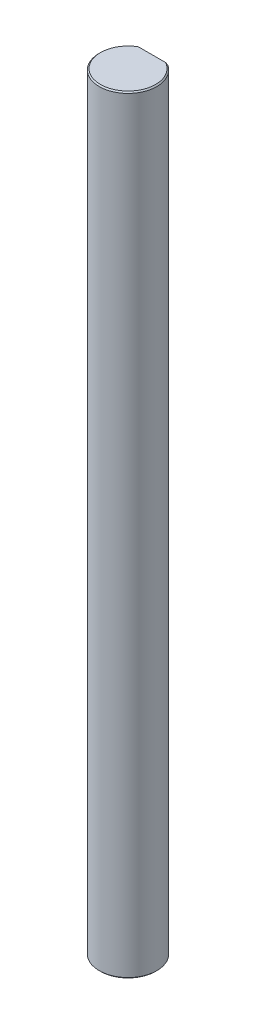
ISO-10303-21;
HEADER;
FILE_DESCRIPTION(('STEP AP214'),'2;1');
FILE_NAME('part.step','',(''),(''),'','','');
FILE_SCHEMA(('AUTOMOTIVE_DESIGN { 1 0 10303 214 1 1 1 1 }'));
ENDSEC;
DATA;
#1=APPLICATION_CONTEXT('core data for automotive mechanical design processes');
#2=APPLICATION_PROTOCOL_DEFINITION('international standard','automotive_design',2000,#1);
#3=PRODUCT_CONTEXT('',#1,'mechanical');
#4=PRODUCT('Part','Part','',(#3));
#5=PRODUCT_RELATED_PRODUCT_CATEGORY('part','',(#4));
#6=PRODUCT_DEFINITION_FORMATION('','',#4);
#7=PRODUCT_DEFINITION_CONTEXT('part definition',#1,'design');
#8=PRODUCT_DEFINITION('design','',#6,#7);
#9=PRODUCT_DEFINITION_SHAPE('','',#8);
#10=(LENGTH_UNIT() NAMED_UNIT(*) SI_UNIT(.MILLI.,.METRE.));
#11=(NAMED_UNIT(*) PLANE_ANGLE_UNIT() SI_UNIT($,.RADIAN.));
#12=(NAMED_UNIT(*) SI_UNIT($,.STERADIAN.) SOLID_ANGLE_UNIT());
#13=UNCERTAINTY_MEASURE_WITH_UNIT(LENGTH_MEASURE(1.E-05),#10,'distance_accuracy_value','');
#14=(GEOMETRIC_REPRESENTATION_CONTEXT(3) GLOBAL_UNCERTAINTY_ASSIGNED_CONTEXT((#13)) GLOBAL_UNIT_ASSIGNED_CONTEXT((#10,
#11,#12)) REPRESENTATION_CONTEXT('',''));
#15=CARTESIAN_POINT('',(0.,0.,0.));
#16=DIRECTION('',(0.,0.,1.));
#17=DIRECTION('',(1.,0.,0.));
#18=AXIS2_PLACEMENT_3D('',#15,#16,#17);
#19=CARTESIAN_POINT('',(0.,0.,0.));
#20=DIRECTION('',(0.,1.,0.));
#21=DIRECTION('',(0.,0.,1.));
#22=AXIS2_PLACEMENT_3D('',#19,#20,#21);
#23=PLANE('',#22);
#24=CARTESIAN_POINT('',(0.,0.,0.));
#25=DIRECTION('',(0.,1.,0.));
#26=DIRECTION('',(0.,0.,1.));
#27=AXIS2_PLACEMENT_3D('',#24,#25,#26);
#28=CIRCLE('',#27,2.87500000001728);
#29=CARTESIAN_POINT('',(-1.41972708646755,0.,-2.5));
#30=VERTEX_POINT('',#29);
#31=CARTESIAN_POINT('',(1.41972708646755,0.,-2.5));
#32=VERTEX_POINT('',#31);
#33=EDGE_CURVE('E20',#30,#32,#28,.T.);
#34=ORIENTED_EDGE('',*,*,#33,.F.);
#35=DIRECTION('',(-1.,0.,0.));
#36=VECTOR('',#35,1.);
#37=CARTESIAN_POINT('',(0.,0.,-2.5));
#38=LINE('',#37,#36);
#39=EDGE_CURVE('E59',#32,#30,#38,.T.);
#40=ORIENTED_EDGE('',*,*,#39,.F.);
#41=EDGE_LOOP('',(#34,#40));
#42=FACE_BOUND('',#41,.T.);
#43=ADVANCED_FACE('F17',(#42),#23,.F.);
#44=CARTESIAN_POINT('',(0.,80.,0.));
#45=DIRECTION('',(0.,1.,0.));
#46=DIRECTION('',(0.,0.,1.));
#47=AXIS2_PLACEMENT_3D('',#44,#45,#46);
#48=PLANE('',#47);
#49=DIRECTION('',(-1.,0.,0.));
#50=VECTOR('',#49,1.);
#51=CARTESIAN_POINT('',(0.,80.,-2.5));
#52=LINE('',#51,#50);
#53=CARTESIAN_POINT('',(-1.41972708638413,79.9999999999921,-2.49999999998279));
#54=VERTEX_POINT('',#53);
#55=CARTESIAN_POINT('',(1.41972708638413,79.9999999999921,-2.49999999998279));
#56=VERTEX_POINT('',#55);
#57=EDGE_CURVE('E67',#54,#56,#52,.F.);
#58=ORIENTED_EDGE('',*,*,#57,.F.);
#59=CARTESIAN_POINT('',(0.,79.9999999999841,0.));
#60=DIRECTION('',(0.,-1.,0.));
#61=DIRECTION('',(0.,0.,-1.));
#62=AXIS2_PLACEMENT_3D('',#59,#60,#61);
#63=CIRCLE('',#62,2.87499999996044);
#64=EDGE_CURVE('E81',#56,#54,#63,.T.);
#65=ORIENTED_EDGE('',*,*,#64,.F.);
#66=EDGE_LOOP('',(#58,#65));
#67=FACE_BOUND('',#66,.T.);
#68=ADVANCED_FACE('F117',(#67),#48,.T.);
#69=CARTESIAN_POINT('',(0.,0.125000000082309,0.));
#70=DIRECTION('',(0.,1.,0.));
#71=DIRECTION('',(0.,0.,1.));
#72=AXIS2_PLACEMENT_3D('',#69,#70,#71);
#73=CONICAL_SURFACE('',#72,3.00000000009959,0.785398163397448);
#74=CARTESIAN_POINT('',(1.6583123951777,0.125000000000014,-2.5));
#75=CARTESIAN_POINT('',(1.53648159923091,0.0576554936557033,-2.5));
#76=CARTESIAN_POINT('',(1.41972708645005,0.,-2.5));
#77=B_SPLINE_CURVE_WITH_KNOTS('',2,(#74,#75,#76),.UNSPECIFIED.,.F.,.F.,(3,3),(0.,1.),.UNSPECIFIED.);
#78=CARTESIAN_POINT('',(1.6583123951777,0.125000000000014,-2.5));
#79=VERTEX_POINT('',#78);
#80=EDGE_CURVE('E61',#79,#32,#77,.T.);
#81=ORIENTED_EDGE('',*,*,#80,.F.);
#82=CARTESIAN_POINT('',(0.,0.125000000000014,0.));
#83=DIRECTION('',(0.,-1.,0.));
#84=DIRECTION('',(0.,0.,-1.));
#85=AXIS2_PLACEMENT_3D('',#82,#83,#84);
#86=CIRCLE('',#85,3.);
#87=CARTESIAN_POINT('',(-1.6583123951777,0.125000000000014,-2.5));
#88=VERTEX_POINT('',#87);
#89=EDGE_CURVE('E65',#88,#79,#86,.F.);
#90=ORIENTED_EDGE('',*,*,#89,.F.);
#91=CARTESIAN_POINT('',(-1.41972708645005,0.,-2.5));
#92=CARTESIAN_POINT('',(-1.53648159923208,0.0576554936563278,-2.5));
#93=CARTESIAN_POINT('',(-1.6583123951777,0.125000000000014,-2.5));
#94=B_SPLINE_CURVE_WITH_KNOTS('',2,(#91,#92,#93),.UNSPECIFIED.,.F.,.F.,(3,3),(0.,1.),.UNSPECIFIED.);
#95=EDGE_CURVE('E63',#30,#88,#94,.T.);
#96=ORIENTED_EDGE('',*,*,#95,.F.);
#97=ORIENTED_EDGE('',*,*,#33,.T.);
#98=EDGE_LOOP('',(#81,#90,#96,#97));
#99=FACE_BOUND('',#98,.T.);
#100=ADVANCED_FACE('F64',(#99),#73,.T.);
#101=CARTESIAN_POINT('',(0.,80.,-2.5));
#102=DIRECTION('',(0.,0.,-1.));
#103=DIRECTION('',(-1.,0.,0.));
#104=AXIS2_PLACEMENT_3D('',#101,#102,#103);
#105=PLANE('',#104);
#106=ORIENTED_EDGE('',*,*,#57,.T.);
#107=CARTESIAN_POINT('',(1.65831239516991,79.8749999999586,-2.49999999998825));
#108=CARTESIAN_POINT('',(1.64826838176816,79.880552028468,-2.50000000042737));
#109=CARTESIAN_POINT('',(1.63820953586368,79.8860772436939,-2.50000000120366));
#110=CARTESIAN_POINT('',(1.61812696085928,79.8970368505675,-2.50000000216666));
#111=CARTESIAN_POINT('',(1.60810342628317,79.9024715986867,-2.50000000235714));
#112=CARTESIAN_POINT('',(1.58809068556603,79.9132502791,-2.50000000092737));
#113=CARTESIAN_POINT('',(1.57810167291724,79.9185945705969,-2.49999999931874));
#114=CARTESIAN_POINT('',(1.55815716530707,79.9291923321743,-2.49999999531701));
#115=CARTESIAN_POINT('',(1.54820186260274,79.9344461640393,-2.49999999292898));
#116=CARTESIAN_POINT('',(1.52832394062326,79.9448630048218,-2.49999998891888));
#117=CARTESIAN_POINT('',(1.51840151216379,79.9500263778204,-2.49999998729208));
#118=CARTESIAN_POINT('',(1.49858848120126,79.960262297792,-2.49999998607419));
#119=CARTESIAN_POINT('',(1.48869806785507,79.9653352108683,-2.49999998647043));
#120=CARTESIAN_POINT('',(1.46894818507344,79.9753902116586,-2.49999998957657));
#121=CARTESIAN_POINT('',(1.45908890291825,79.9803726671648,-2.49999999227213));
#122=CARTESIAN_POINT('',(1.43940037977979,79.990246741915,-2.49999999716559));
#123=CARTESIAN_POINT('',(1.42957132395017,79.9951387303737,-2.49999999936643));
#124=CARTESIAN_POINT('',(1.41972708643055,79.9999999999841,-2.49999999996559));
#125=B_SPLINE_CURVE_WITH_KNOTS('',3,(#107,#108,#109,#110,#111,#112,#113,#114,#115,#116,#117,
#118,#119,#120,#121,#122,#123,#124),.UNSPECIFIED.,.F.,.F.,(4,2,2,2,2,2,2,2,4),(0.,
0.0344291035886779,0.0686352129897365,0.102621448717053,0.136391032119179,0.16994728739444,
0.203293643575441,0.23643363647618,0.269370910594879),.UNSPECIFIED.);
#126=CARTESIAN_POINT('',(1.6583123951738,79.8749999999793,-2.49999999999413));
#127=VERTEX_POINT('',#126);
#128=EDGE_CURVE('E35',#127,#56,#125,.T.);
#129=ORIENTED_EDGE('',*,*,#128,.F.);
#130=DIRECTION('',(0.,-1.,0.));
#131=VECTOR('',#130,1.);
#132=CARTESIAN_POINT('',(1.6583123951777,80.,-2.5));
#133=LINE('',#132,#131);
#134=EDGE_CURVE('E26',#79,#127,#133,.F.);
#135=ORIENTED_EDGE('',*,*,#134,.F.);
#136=ORIENTED_EDGE('',*,*,#80,.T.);
#137=ORIENTED_EDGE('',*,*,#39,.T.);
#138=ORIENTED_EDGE('',*,*,#95,.T.);
#139=DIRECTION('',(0.,-1.,0.));
#140=VECTOR('',#139,1.);
#141=CARTESIAN_POINT('',(-1.6583123951777,80.,-2.5));
#142=LINE('',#141,#140);
#143=CARTESIAN_POINT('',(-1.6583123951777,79.8749999999723,-2.5));
#144=VERTEX_POINT('',#143);
#145=EDGE_CURVE('E77',#144,#88,#142,.T.);
#146=ORIENTED_EDGE('',*,*,#145,.F.);
#147=CARTESIAN_POINT('',(-1.41972708643055,79.9999999999841,-2.49999999996559));
#148=CARTESIAN_POINT('',(-1.42957132395015,79.9951387303737,-2.49999999936644));
#149=CARTESIAN_POINT('',(-1.43940037977976,79.990246741915,-2.49999999716561));
#150=CARTESIAN_POINT('',(-1.4590889029182,79.9803726671648,-2.49999999227216));
#151=CARTESIAN_POINT('',(-1.46894818507337,79.9753902116586,-2.49999998957661));
#152=CARTESIAN_POINT('',(-1.48869806785499,79.9653352108683,-2.49999998647048));
#153=CARTESIAN_POINT('',(-1.49858848120117,79.960262297792,-2.49999998607424));
#154=CARTESIAN_POINT('',(-1.5184015121637,79.9500263778204,-2.49999998729214));
#155=CARTESIAN_POINT('',(-1.52832394062317,79.9448630048218,-2.49999998891894));
#156=CARTESIAN_POINT('',(-1.54820186260265,79.9344461640393,-2.49999999292904));
#157=CARTESIAN_POINT('',(-1.55815716530698,79.9291923321743,-2.49999999531707));
#158=CARTESIAN_POINT('',(-1.57810167291716,79.9185945705969,-2.49999999931879));
#159=CARTESIAN_POINT('',(-1.58809068556595,79.9132502791,-2.50000000092742));
#160=CARTESIAN_POINT('',(-1.60810342628311,79.9024715986867,-2.50000000235718));
#161=CARTESIAN_POINT('',(-1.61812696085923,79.8970368505675,-2.50000000216669));
#162=CARTESIAN_POINT('',(-1.63820953586365,79.8860772436939,-2.50000000120368));
#163=CARTESIAN_POINT('',(-1.64826838176814,79.880552028468,-2.50000000042738));
#164=CARTESIAN_POINT('',(-1.65831239516991,79.8749999999586,-2.49999999998825));
#165=B_SPLINE_CURVE_WITH_KNOTS('',3,(#147,#148,#149,#150,#151,#152,#153,#154,#155,#156,#157,
#158,#159,#160,#161,#162,#163,#164),.UNSPECIFIED.,.F.,.F.,(4,2,2,2,2,2,2,2,4),(0.,
0.0329372741186619,0.0660772670193744,0.0994236232003601,0.132979878475617,0.166749461877748,
0.20073569760508,0.234941807006164,0.269370910594879),.UNSPECIFIED.);
#166=EDGE_CURVE('E85',#54,#144,#165,.T.);
#167=ORIENTED_EDGE('',*,*,#166,.F.);
#168=EDGE_LOOP('',(#106,#129,#135,#136,#137,#138,#146,#167));
#169=FACE_BOUND('',#168,.T.);
#170=ADVANCED_FACE('F69',(#169),#105,.T.);
#171=CARTESIAN_POINT('',(0.,79.8750000000723,0.));
#172=DIRECTION('',(0.,-1.,0.));
#173=DIRECTION('',(0.,0.,-1.));
#174=AXIS2_PLACEMENT_3D('',#171,#172,#173);
#175=CONICAL_SURFACE('',#174,2.99999999987222,0.785398163397448);
#176=ORIENTED_EDGE('',*,*,#128,.T.);
#177=ORIENTED_EDGE('',*,*,#64,.T.);
#178=ORIENTED_EDGE('',*,*,#166,.T.);
#179=CARTESIAN_POINT('',(0.,79.875,0.));
#180=DIRECTION('',(0.,-1.,0.));
#181=DIRECTION('',(0.,0.,-1.));
#182=AXIS2_PLACEMENT_3D('',#179,#180,#181);
#183=CIRCLE('',#182,3.);
#184=EDGE_CURVE('E11',#127,#144,#183,.T.);
#185=ORIENTED_EDGE('',*,*,#184,.F.);
#186=EDGE_LOOP('',(#176,#177,#178,#185));
#187=FACE_BOUND('',#186,.T.);
#188=ADVANCED_FACE('F87',(#187),#175,.T.);
#189=CARTESIAN_POINT('',(0.,80.,0.));
#190=DIRECTION('',(0.,-1.,0.));
#191=DIRECTION('',(0.,0.,-1.));
#192=AXIS2_PLACEMENT_3D('',#189,#190,#191);
#193=CYLINDRICAL_SURFACE('',#192,3.);
#194=ORIENTED_EDGE('',*,*,#134,.T.);
#195=ORIENTED_EDGE('',*,*,#184,.T.);
#196=ORIENTED_EDGE('',*,*,#145,.T.);
#197=ORIENTED_EDGE('',*,*,#89,.T.);
#198=EDGE_LOOP('',(#194,#195,#196,#197));
#199=FACE_BOUND('',#198,.T.);
#200=ADVANCED_FACE('F97',(#199),#193,.T.);
#201=CLOSED_SHELL('',(#43,#68,#100,#170,#188,#200));
#202=MANIFOLD_SOLID_BREP('B1',#201);
#203=ADVANCED_BREP_SHAPE_REPRESENTATION('',(#18,#202),#14);
#204=SHAPE_DEFINITION_REPRESENTATION(#9,#203);
ENDSEC;
END-ISO-10303-21;
